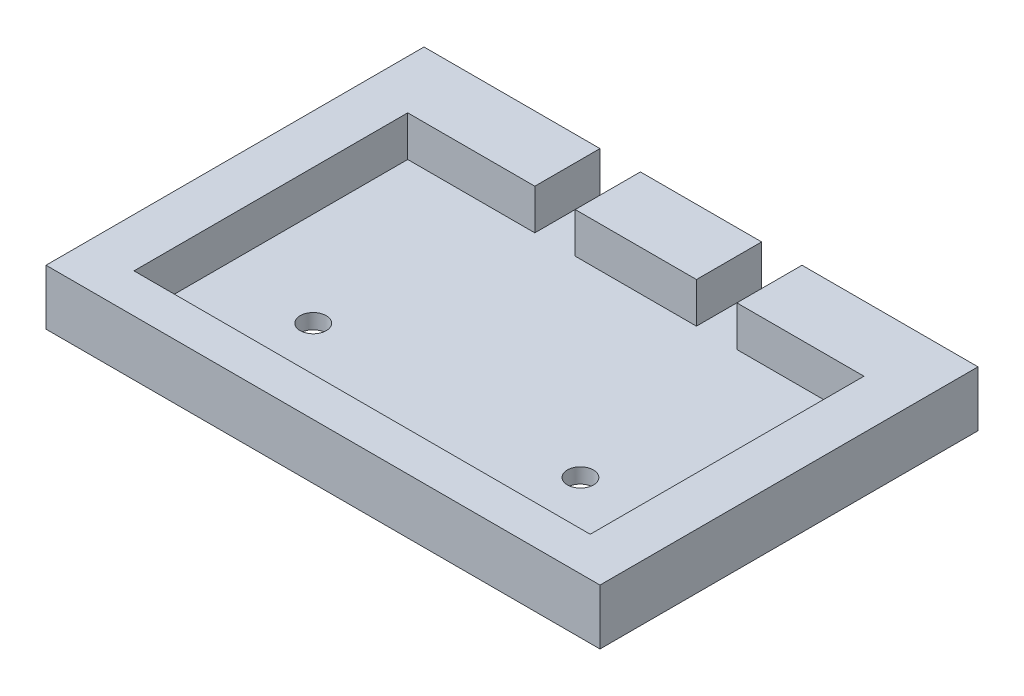
ISO-10303-21;
HEADER;
FILE_DESCRIPTION(('STEP AP214'),'2;1');
FILE_NAME('part.step','',(''),(''),'','','');
FILE_SCHEMA(('AUTOMOTIVE_DESIGN { 1 0 10303 214 1 1 1 1 }'));
ENDSEC;
DATA;
#1=APPLICATION_CONTEXT('core data for automotive mechanical design processes');
#2=APPLICATION_PROTOCOL_DEFINITION('international standard','automotive_design',2000,#1);
#3=PRODUCT_CONTEXT('',#1,'mechanical');
#4=PRODUCT('Part','Part','',(#3));
#5=PRODUCT_RELATED_PRODUCT_CATEGORY('part','',(#4));
#6=PRODUCT_DEFINITION_FORMATION('','',#4);
#7=PRODUCT_DEFINITION_CONTEXT('part definition',#1,'design');
#8=PRODUCT_DEFINITION('design','',#6,#7);
#9=PRODUCT_DEFINITION_SHAPE('','',#8);
#10=(LENGTH_UNIT() NAMED_UNIT(*) SI_UNIT(.MILLI.,.METRE.));
#11=(NAMED_UNIT(*) PLANE_ANGLE_UNIT() SI_UNIT($,.RADIAN.));
#12=(NAMED_UNIT(*) SI_UNIT($,.STERADIAN.) SOLID_ANGLE_UNIT());
#13=UNCERTAINTY_MEASURE_WITH_UNIT(LENGTH_MEASURE(1.E-05),#10,'distance_accuracy_value','');
#14=(GEOMETRIC_REPRESENTATION_CONTEXT(3) GLOBAL_UNCERTAINTY_ASSIGNED_CONTEXT((#13)) GLOBAL_UNIT_ASSIGNED_CONTEXT((#10,
#11,#12)) REPRESENTATION_CONTEXT('',''));
#15=CARTESIAN_POINT('',(0.,0.,0.));
#16=DIRECTION('',(0.,0.,1.));
#17=DIRECTION('',(1.,0.,0.));
#18=AXIS2_PLACEMENT_3D('',#15,#16,#17);
#19=CARTESIAN_POINT('',(45.5,12.,-35.));
#20=DIRECTION('',(0.,0.,1.));
#21=DIRECTION('',(1.,0.,0.));
#22=AXIS2_PLACEMENT_3D('',#19,#20,#21);
#23=PLANE('',#22);
#24=DIRECTION('',(0.,1.,0.));
#25=VECTOR('',#24,1.);
#26=CARTESIAN_POINT('',(42.5,12.,-35.));
#27=LINE('',#26,#25);
#28=CARTESIAN_POINT('',(42.5,3.5,-35.));
#29=VERTEX_POINT('',#28);
#30=CARTESIAN_POINT('',(42.5,12.,-35.));
#31=VERTEX_POINT('',#30);
#32=EDGE_CURVE('E174',#29,#31,#27,.T.);
#33=ORIENTED_EDGE('',*,*,#32,.F.);
#34=DIRECTION('',(1.,0.,0.));
#35=VECTOR('',#34,1.);
#36=CARTESIAN_POINT('',(42.5,3.5,-35.));
#37=LINE('',#36,#35);
#38=CARTESIAN_POINT('',(-42.5,3.5,-35.));
#39=VERTEX_POINT('',#38);
#40=EDGE_CURVE('E276',#39,#29,#37,.T.);
#41=ORIENTED_EDGE('',*,*,#40,.F.);
#42=DIRECTION('',(0.,-1.,0.));
#43=VECTOR('',#42,1.);
#44=CARTESIAN_POINT('',(-42.5,12.,-35.));
#45=LINE('',#44,#43);
#46=CARTESIAN_POINT('',(-42.5,12.,-35.));
#47=VERTEX_POINT('',#46);
#48=EDGE_CURVE('E176',#47,#39,#45,.T.);
#49=ORIENTED_EDGE('',*,*,#48,.F.);
#50=DIRECTION('',(-1.,0.,0.));
#51=VECTOR('',#50,1.);
#52=CARTESIAN_POINT('',(45.5,12.,-35.));
#53=LINE('',#52,#51);
#54=CARTESIAN_POINT('',(-15.5,12.,-35.));
#55=VERTEX_POINT('',#54);
#56=EDGE_CURVE('E246',#55,#47,#53,.T.);
#57=ORIENTED_EDGE('',*,*,#56,.F.);
#58=DIRECTION('',(0.,1.,0.));
#59=VECTOR('',#58,1.);
#60=CARTESIAN_POINT('',(-15.5,12.,-35.));
#61=LINE('',#60,#59);
#62=CARTESIAN_POINT('',(-15.5,5.8,-35.));
#63=VERTEX_POINT('',#62);
#64=EDGE_CURVE('E256',#63,#55,#61,.T.);
#65=ORIENTED_EDGE('',*,*,#64,.F.);
#66=DIRECTION('',(-1.,0.,0.));
#67=VECTOR('',#66,1.);
#68=CARTESIAN_POINT('',(-9.29999999999998,5.8,-35.));
#69=LINE('',#68,#67);
#70=CARTESIAN_POINT('',(-9.29999999999998,5.8,-35.));
#71=VERTEX_POINT('',#70);
#72=EDGE_CURVE('E253',#71,#63,#69,.T.);
#73=ORIENTED_EDGE('',*,*,#72,.F.);
#74=DIRECTION('',(0.,-1.,0.));
#75=VECTOR('',#74,1.);
#76=CARTESIAN_POINT('',(-9.29999999999998,12.,-35.));
#77=LINE('',#76,#75);
#78=CARTESIAN_POINT('',(-9.29999999999998,12.,-35.));
#79=VERTEX_POINT('',#78);
#80=EDGE_CURVE('E236',#79,#71,#77,.T.);
#81=ORIENTED_EDGE('',*,*,#80,.F.);
#82=CARTESIAN_POINT('',(9.30000000000002,12.,-35.));
#83=VERTEX_POINT('',#82);
#84=EDGE_CURVE('E265',#83,#79,#53,.T.);
#85=ORIENTED_EDGE('',*,*,#84,.F.);
#86=DIRECTION('',(0.,1.,0.));
#87=VECTOR('',#86,1.);
#88=CARTESIAN_POINT('',(9.30000000000002,12.,-35.));
#89=LINE('',#88,#87);
#90=CARTESIAN_POINT('',(9.30000000000002,5.8,-35.));
#91=VERTEX_POINT('',#90);
#92=EDGE_CURVE('E241',#91,#83,#89,.T.);
#93=ORIENTED_EDGE('',*,*,#92,.F.);
#94=DIRECTION('',(-1.,0.,0.));
#95=VECTOR('',#94,1.);
#96=CARTESIAN_POINT('',(15.5,5.8,-35.));
#97=LINE('',#96,#95);
#98=CARTESIAN_POINT('',(15.5,5.8,-35.));
#99=VERTEX_POINT('',#98);
#100=EDGE_CURVE('E239',#99,#91,#97,.T.);
#101=ORIENTED_EDGE('',*,*,#100,.F.);
#102=DIRECTION('',(0.,-1.,0.));
#103=VECTOR('',#102,1.);
#104=CARTESIAN_POINT('',(15.5,12.,-35.));
#105=LINE('',#104,#103);
#106=CARTESIAN_POINT('',(15.5,12.,-35.));
#107=VERTEX_POINT('',#106);
#108=EDGE_CURVE('E237',#107,#99,#105,.T.);
#109=ORIENTED_EDGE('',*,*,#108,.F.);
#110=EDGE_CURVE('E43',#31,#107,#53,.T.);
#111=ORIENTED_EDGE('',*,*,#110,.F.);
#112=EDGE_LOOP('',(#33,#41,#49,#57,#65,#73,#81,#85,#93,#101,#109,#111));
#113=FACE_BOUND('',#112,.T.);
#114=ADVANCED_FACE('F36',(#113),#23,.F.);
#115=CARTESIAN_POINT('',(0.,12.,0.));
#116=DIRECTION('',(0.,1.,0.));
#117=DIRECTION('',(0.,0.,1.));
#118=AXIS2_PLACEMENT_3D('',#115,#116,#117);
#119=PLANE('',#118);
#120=DIRECTION('',(-1.,0.,0.));
#121=VECTOR('',#120,1.);
#122=CARTESIAN_POINT('',(-42.5,12.,23.));
#123=LINE('',#122,#121);
#124=CARTESIAN_POINT('',(42.5,12.,23.));
#125=VERTEX_POINT('',#124);
#126=CARTESIAN_POINT('',(-42.5,12.,23.));
#127=VERTEX_POINT('',#126);
#128=EDGE_CURVE('E160',#125,#127,#123,.T.);
#129=ORIENTED_EDGE('',*,*,#128,.F.);
#130=DIRECTION('',(0.,0.,-1.));
#131=VECTOR('',#130,1.);
#132=CARTESIAN_POINT('',(42.5,12.,-42.1667108690839));
#133=LINE('',#132,#131);
#134=EDGE_CURVE('E167',#125,#31,#133,.T.);
#135=ORIENTED_EDGE('',*,*,#134,.T.);
#136=ORIENTED_EDGE('',*,*,#110,.T.);
#137=DIRECTION('',(0.,0.,-1.));
#138=VECTOR('',#137,1.);
#139=CARTESIAN_POINT('',(15.5,12.,-20.));
#140=LINE('',#139,#138);
#141=CARTESIAN_POINT('',(15.5,12.,-25.));
#142=VERTEX_POINT('',#141);
#143=EDGE_CURVE('E244',#142,#107,#140,.T.);
#144=ORIENTED_EDGE('',*,*,#143,.F.);
#145=DIRECTION('',(-1.,0.,0.));
#146=VECTOR('',#145,1.);
#147=CARTESIAN_POINT('',(-35.,12.,-25.));
#148=LINE('',#147,#146);
#149=CARTESIAN_POINT('',(35.,12.,-25.));
#150=VERTEX_POINT('',#149);
#151=EDGE_CURVE('E185',#150,#142,#148,.T.);
#152=ORIENTED_EDGE('',*,*,#151,.F.);
#153=DIRECTION('',(0.,0.,-1.));
#154=VECTOR('',#153,1.);
#155=CARTESIAN_POINT('',(35.,12.,-25.));
#156=LINE('',#155,#154);
#157=CARTESIAN_POINT('',(35.,12.,17.));
#158=VERTEX_POINT('',#157);
#159=EDGE_CURVE('E190',#158,#150,#156,.T.);
#160=ORIENTED_EDGE('',*,*,#159,.F.);
#161=DIRECTION('',(1.,0.,0.));
#162=VECTOR('',#161,1.);
#163=CARTESIAN_POINT('',(-35.,12.,17.));
#164=LINE('',#163,#162);
#165=CARTESIAN_POINT('',(-35.,12.,17.));
#166=VERTEX_POINT('',#165);
#167=EDGE_CURVE('E193',#166,#158,#164,.T.);
#168=ORIENTED_EDGE('',*,*,#167,.F.);
#169=DIRECTION('',(0.,0.,1.));
#170=VECTOR('',#169,1.);
#171=CARTESIAN_POINT('',(-35.,12.,-25.));
#172=LINE('',#171,#170);
#173=CARTESIAN_POINT('',(-35.,12.,-25.));
#174=VERTEX_POINT('',#173);
#175=EDGE_CURVE('E184',#174,#166,#172,.T.);
#176=ORIENTED_EDGE('',*,*,#175,.F.);
#177=CARTESIAN_POINT('',(-15.5,12.,-25.));
#178=VERTEX_POINT('',#177);
#179=EDGE_CURVE('E189',#178,#174,#148,.T.);
#180=ORIENTED_EDGE('',*,*,#179,.F.);
#181=DIRECTION('',(0.,0.,-1.));
#182=VECTOR('',#181,1.);
#183=CARTESIAN_POINT('',(-15.5,12.,-20.));
#184=LINE('',#183,#182);
#185=EDGE_CURVE('E261',#178,#55,#184,.T.);
#186=ORIENTED_EDGE('',*,*,#185,.T.);
#187=ORIENTED_EDGE('',*,*,#56,.T.);
#188=DIRECTION('',(0.,0.,1.));
#189=VECTOR('',#188,1.);
#190=CARTESIAN_POINT('',(-42.5,12.,-42.1667108690839));
#191=LINE('',#190,#189);
#192=EDGE_CURVE('E170',#47,#127,#191,.T.);
#193=ORIENTED_EDGE('',*,*,#192,.T.);
#194=EDGE_LOOP('',(#129,#135,#136,#144,#152,#160,#168,#176,#180,#186,#187,#193));
#195=FACE_BOUND('',#194,.T.);
#196=ADVANCED_FACE('F166',(#195),#119,.T.);
#197=CARTESIAN_POINT('',(9.30000000000002,12.,-25.));
#198=VERTEX_POINT('',#197);
#199=CARTESIAN_POINT('',(-9.29999999999998,12.,-25.));
#200=VERTEX_POINT('',#199);
#201=EDGE_CURVE('E188',#198,#200,#148,.T.);
#202=ORIENTED_EDGE('',*,*,#201,.F.);
#203=DIRECTION('',(0.,0.,-1.));
#204=VECTOR('',#203,1.);
#205=CARTESIAN_POINT('',(9.30000000000002,12.,-20.));
#206=LINE('',#205,#204);
#207=EDGE_CURVE('E247',#198,#83,#206,.T.);
#208=ORIENTED_EDGE('',*,*,#207,.T.);
#209=ORIENTED_EDGE('',*,*,#84,.T.);
#210=DIRECTION('',(0.,0.,-1.));
#211=VECTOR('',#210,1.);
#212=CARTESIAN_POINT('',(-9.29999999999998,12.,-20.));
#213=LINE('',#212,#211);
#214=EDGE_CURVE('E80',#200,#79,#213,.T.);
#215=ORIENTED_EDGE('',*,*,#214,.F.);
#216=EDGE_LOOP('',(#202,#208,#209,#215));
#217=FACE_BOUND('',#216,.T.);
#218=ADVANCED_FACE('F311',(#217),#119,.T.);
#219=CARTESIAN_POINT('',(20.5,0.,4.00000000000002));
#220=DIRECTION('',(0.,1.,0.));
#221=DIRECTION('',(0.,0.,1.));
#222=AXIS2_PLACEMENT_3D('',#219,#220,#221);
#223=CYLINDRICAL_SURFACE('',#222,2.);
#224=CARTESIAN_POINT('',(20.5,3.5,4.00000000000002));
#225=DIRECTION('',(0.,1.,0.));
#226=DIRECTION('',(0.,0.,1.));
#227=AXIS2_PLACEMENT_3D('',#224,#225,#226);
#228=CIRCLE('',#227,2.);
#229=CARTESIAN_POINT('',(20.5,3.5,6.00000000000002));
#230=VERTEX_POINT('',#229);
#231=EDGE_CURVE('E178',#230,#230,#228,.F.);
#232=ORIENTED_EDGE('',*,*,#231,.T.);
#233=EDGE_LOOP('',(#232));
#234=FACE_BOUND('',#233,.T.);
#235=CARTESIAN_POINT('',(20.5,5.8,4.00000000000002));
#236=DIRECTION('',(0.,-1.,0.));
#237=DIRECTION('',(0.,0.,-1.));
#238=AXIS2_PLACEMENT_3D('',#235,#236,#237);
#239=CIRCLE('',#238,2.);
#240=CARTESIAN_POINT('',(20.5,5.8,2.00000000000001));
#241=VERTEX_POINT('',#240);
#242=EDGE_CURVE('E222',#241,#241,#239,.F.);
#243=ORIENTED_EDGE('',*,*,#242,.T.);
#244=EDGE_LOOP('',(#243));
#245=FACE_BOUND('',#244,.T.);
#246=ADVANCED_FACE('F292',(#234,#245),#223,.F.);
#247=CARTESIAN_POINT('',(-20.5,0.,4.00000000000002));
#248=DIRECTION('',(0.,1.,0.));
#249=DIRECTION('',(0.,0.,1.));
#250=AXIS2_PLACEMENT_3D('',#247,#248,#249);
#251=CYLINDRICAL_SURFACE('',#250,2.);
#252=CARTESIAN_POINT('',(-20.5,3.5,4.00000000000002));
#253=DIRECTION('',(0.,1.,0.));
#254=DIRECTION('',(0.,0.,1.));
#255=AXIS2_PLACEMENT_3D('',#252,#253,#254);
#256=CIRCLE('',#255,2.);
#257=CARTESIAN_POINT('',(-20.5,3.5,6.00000000000002));
#258=VERTEX_POINT('',#257);
#259=EDGE_CURVE('E286',#258,#258,#256,.F.);
#260=ORIENTED_EDGE('',*,*,#259,.T.);
#261=EDGE_LOOP('',(#260));
#262=FACE_BOUND('',#261,.T.);
#263=CARTESIAN_POINT('',(-20.5,5.8,4.00000000000002));
#264=DIRECTION('',(0.,-1.,0.));
#265=DIRECTION('',(0.,0.,-1.));
#266=AXIS2_PLACEMENT_3D('',#263,#264,#265);
#267=CIRCLE('',#266,2.);
#268=CARTESIAN_POINT('',(-20.5,5.8,2.00000000000001));
#269=VERTEX_POINT('',#268);
#270=EDGE_CURVE('E219',#269,#269,#267,.F.);
#271=ORIENTED_EDGE('',*,*,#270,.T.);
#272=EDGE_LOOP('',(#271));
#273=FACE_BOUND('',#272,.T.);
#274=ADVANCED_FACE('F319',(#262,#273),#251,.F.);
#275=CARTESIAN_POINT('',(-9.29999999999998,12.,-20.));
#276=DIRECTION('',(1.,0.,0.));
#277=DIRECTION('',(0.,0.,-1.));
#278=AXIS2_PLACEMENT_3D('',#275,#276,#277);
#279=PLANE('',#278);
#280=DIRECTION('',(0.,0.,-1.));
#281=VECTOR('',#280,1.);
#282=CARTESIAN_POINT('',(-9.29999999999998,5.8,-20.));
#283=LINE('',#282,#281);
#284=CARTESIAN_POINT('',(-9.29999999999998,5.8,-25.));
#285=VERTEX_POINT('',#284);
#286=EDGE_CURVE('E259',#285,#71,#283,.T.);
#287=ORIENTED_EDGE('',*,*,#286,.F.);
#288=DIRECTION('',(0.,1.,0.));
#289=VECTOR('',#288,1.);
#290=CARTESIAN_POINT('',(-9.29999999999998,12.,-25.));
#291=LINE('',#290,#289);
#292=EDGE_CURVE('E234',#285,#200,#291,.T.);
#293=ORIENTED_EDGE('',*,*,#292,.T.);
#294=ORIENTED_EDGE('',*,*,#214,.T.);
#295=ORIENTED_EDGE('',*,*,#80,.T.);
#296=EDGE_LOOP('',(#287,#293,#294,#295));
#297=FACE_BOUND('',#296,.T.);
#298=ADVANCED_FACE('F322',(#297),#279,.F.);
#299=CARTESIAN_POINT('',(-15.5,12.,-20.));
#300=DIRECTION('',(-1.,0.,0.));
#301=DIRECTION('',(0.,0.,1.));
#302=AXIS2_PLACEMENT_3D('',#299,#300,#301);
#303=PLANE('',#302);
#304=ORIENTED_EDGE('',*,*,#185,.F.);
#305=DIRECTION('',(0.,-1.,0.));
#306=VECTOR('',#305,1.);
#307=CARTESIAN_POINT('',(-15.5,12.,-25.));
#308=LINE('',#307,#306);
#309=CARTESIAN_POINT('',(-15.5,5.8,-25.));
#310=VERTEX_POINT('',#309);
#311=EDGE_CURVE('E231',#178,#310,#308,.T.);
#312=ORIENTED_EDGE('',*,*,#311,.T.);
#313=DIRECTION('',(0.,0.,-1.));
#314=VECTOR('',#313,1.);
#315=CARTESIAN_POINT('',(-15.5,5.8,-20.));
#316=LINE('',#315,#314);
#317=EDGE_CURVE('E263',#310,#63,#316,.T.);
#318=ORIENTED_EDGE('',*,*,#317,.T.);
#319=ORIENTED_EDGE('',*,*,#64,.T.);
#320=EDGE_LOOP('',(#304,#312,#318,#319));
#321=FACE_BOUND('',#320,.T.);
#322=ADVANCED_FACE('F326',(#321),#303,.F.);
#323=CARTESIAN_POINT('',(15.5,12.,-20.));
#324=DIRECTION('',(1.,0.,0.));
#325=DIRECTION('',(0.,0.,-1.));
#326=AXIS2_PLACEMENT_3D('',#323,#324,#325);
#327=PLANE('',#326);
#328=DIRECTION('',(0.,0.,-1.));
#329=VECTOR('',#328,1.);
#330=CARTESIAN_POINT('',(15.5,5.8,-20.));
#331=LINE('',#330,#329);
#332=CARTESIAN_POINT('',(15.5,5.8,-25.));
#333=VERTEX_POINT('',#332);
#334=EDGE_CURVE('E88',#333,#99,#331,.T.);
#335=ORIENTED_EDGE('',*,*,#334,.F.);
#336=DIRECTION('',(0.,1.,0.));
#337=VECTOR('',#336,1.);
#338=CARTESIAN_POINT('',(15.5,12.,-25.));
#339=LINE('',#338,#337);
#340=EDGE_CURVE('E228',#333,#142,#339,.T.);
#341=ORIENTED_EDGE('',*,*,#340,.T.);
#342=ORIENTED_EDGE('',*,*,#143,.T.);
#343=ORIENTED_EDGE('',*,*,#108,.T.);
#344=EDGE_LOOP('',(#335,#341,#342,#343));
#345=FACE_BOUND('',#344,.T.);
#346=ADVANCED_FACE('F329',(#345),#327,.F.);
#347=CARTESIAN_POINT('',(9.30000000000002,12.,-20.));
#348=DIRECTION('',(-1.,0.,0.));
#349=DIRECTION('',(0.,0.,1.));
#350=AXIS2_PLACEMENT_3D('',#347,#348,#349);
#351=PLANE('',#350);
#352=ORIENTED_EDGE('',*,*,#207,.F.);
#353=DIRECTION('',(0.,-1.,0.));
#354=VECTOR('',#353,1.);
#355=CARTESIAN_POINT('',(9.30000000000002,12.,-25.));
#356=LINE('',#355,#354);
#357=CARTESIAN_POINT('',(9.30000000000002,5.8,-25.));
#358=VERTEX_POINT('',#357);
#359=EDGE_CURVE('E225',#198,#358,#356,.T.);
#360=ORIENTED_EDGE('',*,*,#359,.T.);
#361=DIRECTION('',(0.,0.,-1.));
#362=VECTOR('',#361,1.);
#363=CARTESIAN_POINT('',(9.30000000000002,5.8,-20.));
#364=LINE('',#363,#362);
#365=EDGE_CURVE('E249',#358,#91,#364,.T.);
#366=ORIENTED_EDGE('',*,*,#365,.T.);
#367=ORIENTED_EDGE('',*,*,#92,.T.);
#368=EDGE_LOOP('',(#352,#360,#366,#367));
#369=FACE_BOUND('',#368,.T.);
#370=ADVANCED_FACE('F333',(#369),#351,.F.);
#371=CARTESIAN_POINT('',(15.5,5.8,-20.));
#372=DIRECTION('',(0.,-1.,0.));
#373=DIRECTION('',(0.,0.,-1.));
#374=AXIS2_PLACEMENT_3D('',#371,#372,#373);
#375=PLANE('',#374);
#376=DIRECTION('',(-1.,0.,0.));
#377=VECTOR('',#376,1.);
#378=CARTESIAN_POINT('',(-35.,5.8,-25.));
#379=LINE('',#378,#377);
#380=EDGE_CURVE('E208',#358,#285,#379,.T.);
#381=ORIENTED_EDGE('',*,*,#380,.T.);
#382=ORIENTED_EDGE('',*,*,#286,.T.);
#383=ORIENTED_EDGE('',*,*,#72,.T.);
#384=ORIENTED_EDGE('',*,*,#317,.F.);
#385=CARTESIAN_POINT('',(-35.,5.8,-25.));
#386=VERTEX_POINT('',#385);
#387=EDGE_CURVE('E209',#310,#386,#379,.T.);
#388=ORIENTED_EDGE('',*,*,#387,.T.);
#389=DIRECTION('',(0.,0.,1.));
#390=VECTOR('',#389,1.);
#391=CARTESIAN_POINT('',(-35.,5.8,-25.));
#392=LINE('',#391,#390);
#393=CARTESIAN_POINT('',(-35.,5.8,17.));
#394=VERTEX_POINT('',#393);
#395=EDGE_CURVE('E201',#386,#394,#392,.T.);
#396=ORIENTED_EDGE('',*,*,#395,.T.);
#397=DIRECTION('',(1.,0.,0.));
#398=VECTOR('',#397,1.);
#399=CARTESIAN_POINT('',(-35.,5.8,17.));
#400=LINE('',#399,#398);
#401=CARTESIAN_POINT('',(35.,5.8,17.));
#402=VERTEX_POINT('',#401);
#403=EDGE_CURVE('E187',#394,#402,#400,.T.);
#404=ORIENTED_EDGE('',*,*,#403,.T.);
#405=DIRECTION('',(0.,0.,-1.));
#406=VECTOR('',#405,1.);
#407=CARTESIAN_POINT('',(35.,5.8,-25.));
#408=LINE('',#407,#406);
#409=CARTESIAN_POINT('',(35.,5.8,-25.));
#410=VERTEX_POINT('',#409);
#411=EDGE_CURVE('E210',#402,#410,#408,.T.);
#412=ORIENTED_EDGE('',*,*,#411,.T.);
#413=EDGE_CURVE('E206',#410,#333,#379,.T.);
#414=ORIENTED_EDGE('',*,*,#413,.T.);
#415=ORIENTED_EDGE('',*,*,#334,.T.);
#416=ORIENTED_EDGE('',*,*,#100,.T.);
#417=ORIENTED_EDGE('',*,*,#365,.F.);
#418=EDGE_LOOP('',(#381,#382,#383,#384,#388,#396,#404,#412,#414,#415,#416,#417));
#419=FACE_BOUND('',#418,.T.);
#420=ORIENTED_EDGE('',*,*,#270,.F.);
#421=EDGE_LOOP('',(#420));
#422=FACE_BOUND('',#421,.T.);
#423=ORIENTED_EDGE('',*,*,#242,.F.);
#424=EDGE_LOOP('',(#423));
#425=FACE_BOUND('',#424,.T.);
#426=ADVANCED_FACE('F335',(#419,#422,#425),#375,.F.);
#427=CARTESIAN_POINT('',(-35.,-75.8333265278342,-25.));
#428=DIRECTION('',(0.,0.,-1.));
#429=DIRECTION('',(-1.,0.,0.));
#430=AXIS2_PLACEMENT_3D('',#427,#428,#429);
#431=PLANE('',#430);
#432=ORIENTED_EDGE('',*,*,#380,.F.);
#433=ORIENTED_EDGE('',*,*,#359,.F.);
#434=ORIENTED_EDGE('',*,*,#201,.T.);
#435=ORIENTED_EDGE('',*,*,#292,.F.);
#436=EDGE_LOOP('',(#432,#433,#434,#435));
#437=FACE_BOUND('',#436,.T.);
#438=ADVANCED_FACE('F338',(#437),#431,.F.);
#439=ORIENTED_EDGE('',*,*,#179,.T.);
#440=DIRECTION('',(0.,1.,0.));
#441=VECTOR('',#440,1.);
#442=CARTESIAN_POINT('',(-35.,-75.8333265278342,-25.));
#443=LINE('',#442,#441);
#444=EDGE_CURVE('E205',#386,#174,#443,.T.);
#445=ORIENTED_EDGE('',*,*,#444,.F.);
#446=ORIENTED_EDGE('',*,*,#387,.F.);
#447=ORIENTED_EDGE('',*,*,#311,.F.);
#448=EDGE_LOOP('',(#439,#445,#446,#447));
#449=FACE_BOUND('',#448,.T.);
#450=ADVANCED_FACE('F354',(#449),#431,.F.);
#451=ORIENTED_EDGE('',*,*,#413,.F.);
#452=DIRECTION('',(0.,1.,0.));
#453=VECTOR('',#452,1.);
#454=CARTESIAN_POINT('',(35.,-75.8333265278342,-25.));
#455=LINE('',#454,#453);
#456=EDGE_CURVE('E213',#410,#150,#455,.T.);
#457=ORIENTED_EDGE('',*,*,#456,.T.);
#458=ORIENTED_EDGE('',*,*,#151,.T.);
#459=ORIENTED_EDGE('',*,*,#340,.F.);
#460=EDGE_LOOP('',(#451,#457,#458,#459));
#461=FACE_BOUND('',#460,.T.);
#462=ADVANCED_FACE('F346',(#461),#431,.F.);
#463=CARTESIAN_POINT('',(-35.,-75.8333265278342,17.));
#464=DIRECTION('',(0.,0.,1.));
#465=DIRECTION('',(1.,0.,0.));
#466=AXIS2_PLACEMENT_3D('',#463,#464,#465);
#467=PLANE('',#466);
#468=DIRECTION('',(0.,1.,0.));
#469=VECTOR('',#468,1.);
#470=CARTESIAN_POINT('',(-35.,-75.8333265278342,17.));
#471=LINE('',#470,#469);
#472=EDGE_CURVE('E204',#394,#166,#471,.T.);
#473=ORIENTED_EDGE('',*,*,#472,.T.);
#474=ORIENTED_EDGE('',*,*,#167,.T.);
#475=DIRECTION('',(0.,1.,0.));
#476=VECTOR('',#475,1.);
#477=CARTESIAN_POINT('',(35.,-75.8333265278342,17.));
#478=LINE('',#477,#476);
#479=EDGE_CURVE('E200',#402,#158,#478,.T.);
#480=ORIENTED_EDGE('',*,*,#479,.F.);
#481=ORIENTED_EDGE('',*,*,#403,.F.);
#482=EDGE_LOOP('',(#473,#474,#480,#481));
#483=FACE_BOUND('',#482,.T.);
#484=ADVANCED_FACE('F342',(#483),#467,.F.);
#485=CARTESIAN_POINT('',(35.,-75.8333265278342,-25.));
#486=DIRECTION('',(1.,0.,0.));
#487=DIRECTION('',(0.,0.,-1.));
#488=AXIS2_PLACEMENT_3D('',#485,#486,#487);
#489=PLANE('',#488);
#490=ORIENTED_EDGE('',*,*,#479,.T.);
#491=ORIENTED_EDGE('',*,*,#159,.T.);
#492=ORIENTED_EDGE('',*,*,#456,.F.);
#493=ORIENTED_EDGE('',*,*,#411,.F.);
#494=EDGE_LOOP('',(#490,#491,#492,#493));
#495=FACE_BOUND('',#494,.T.);
#496=ADVANCED_FACE('F345',(#495),#489,.F.);
#497=CARTESIAN_POINT('',(-35.,-75.8333265278342,-25.));
#498=DIRECTION('',(-1.,0.,0.));
#499=DIRECTION('',(0.,0.,1.));
#500=AXIS2_PLACEMENT_3D('',#497,#498,#499);
#501=PLANE('',#500);
#502=ORIENTED_EDGE('',*,*,#444,.T.);
#503=ORIENTED_EDGE('',*,*,#175,.T.);
#504=ORIENTED_EDGE('',*,*,#472,.F.);
#505=ORIENTED_EDGE('',*,*,#395,.F.);
#506=EDGE_LOOP('',(#502,#503,#504,#505));
#507=FACE_BOUND('',#506,.T.);
#508=ADVANCED_FACE('F350',(#507),#501,.F.);
#509=CARTESIAN_POINT('',(-42.5,-16.,-42.1667108690839));
#510=DIRECTION('',(-1.,0.,0.));
#511=DIRECTION('',(0.,0.,1.));
#512=AXIS2_PLACEMENT_3D('',#509,#510,#511);
#513=PLANE('',#512);
#514=DIRECTION('',(0.,1.,0.));
#515=VECTOR('',#514,1.);
#516=CARTESIAN_POINT('',(-42.5,-5.,23.));
#517=LINE('',#516,#515);
#518=CARTESIAN_POINT('',(-42.5,3.5,23.));
#519=VERTEX_POINT('',#518);
#520=EDGE_CURVE('E50',#519,#127,#517,.T.);
#521=ORIENTED_EDGE('',*,*,#520,.T.);
#522=ORIENTED_EDGE('',*,*,#192,.F.);
#523=ORIENTED_EDGE('',*,*,#48,.T.);
#524=DIRECTION('',(0.,0.,-1.));
#525=VECTOR('',#524,1.);
#526=CARTESIAN_POINT('',(-42.5,3.5,33.));
#527=LINE('',#526,#525);
#528=EDGE_CURVE('E280',#519,#39,#527,.T.);
#529=ORIENTED_EDGE('',*,*,#528,.F.);
#530=EDGE_LOOP('',(#521,#522,#523,#529));
#531=FACE_BOUND('',#530,.T.);
#532=ADVANCED_FACE('F279',(#531),#513,.T.);
#533=CARTESIAN_POINT('',(42.5,-16.,-42.1667108690839));
#534=DIRECTION('',(1.,0.,0.));
#535=DIRECTION('',(0.,0.,-1.));
#536=AXIS2_PLACEMENT_3D('',#533,#534,#535);
#537=PLANE('',#536);
#538=DIRECTION('',(0.,1.,0.));
#539=VECTOR('',#538,1.);
#540=CARTESIAN_POINT('',(42.5,-5.,23.));
#541=LINE('',#540,#539);
#542=CARTESIAN_POINT('',(42.5,3.5,23.));
#543=VERTEX_POINT('',#542);
#544=EDGE_CURVE('E157',#543,#125,#541,.T.);
#545=ORIENTED_EDGE('',*,*,#544,.F.);
#546=DIRECTION('',(0.,0.,-1.));
#547=VECTOR('',#546,1.);
#548=CARTESIAN_POINT('',(42.5,3.5,33.));
#549=LINE('',#548,#547);
#550=EDGE_CURVE('E284',#543,#29,#549,.T.);
#551=ORIENTED_EDGE('',*,*,#550,.T.);
#552=ORIENTED_EDGE('',*,*,#32,.T.);
#553=ORIENTED_EDGE('',*,*,#134,.F.);
#554=EDGE_LOOP('',(#545,#551,#552,#553));
#555=FACE_BOUND('',#554,.T.);
#556=ADVANCED_FACE('F172',(#555),#537,.T.);
#557=CARTESIAN_POINT('',(42.5,3.5,33.));
#558=DIRECTION('',(0.,1.,0.));
#559=DIRECTION('',(0.,0.,1.));
#560=AXIS2_PLACEMENT_3D('',#557,#558,#559);
#561=PLANE('',#560);
#562=ORIENTED_EDGE('',*,*,#259,.F.);
#563=EDGE_LOOP('',(#562));
#564=FACE_BOUND('',#563,.T.);
#565=ORIENTED_EDGE('',*,*,#550,.F.);
#566=DIRECTION('',(-1.,0.,0.));
#567=VECTOR('',#566,1.);
#568=CARTESIAN_POINT('',(42.5,3.5,23.));
#569=LINE('',#568,#567);
#570=EDGE_CURVE('E11',#543,#519,#569,.T.);
#571=ORIENTED_EDGE('',*,*,#570,.T.);
#572=ORIENTED_EDGE('',*,*,#528,.T.);
#573=ORIENTED_EDGE('',*,*,#40,.T.);
#574=EDGE_LOOP('',(#565,#571,#572,#573));
#575=FACE_BOUND('',#574,.T.);
#576=ORIENTED_EDGE('',*,*,#231,.F.);
#577=EDGE_LOOP('',(#576));
#578=FACE_BOUND('',#577,.T.);
#579=ADVANCED_FACE('F295',(#564,#575,#578),#561,.F.);
#580=CARTESIAN_POINT('',(-42.5,-5.,23.));
#581=DIRECTION('',(0.,0.,-1.));
#582=DIRECTION('',(-1.,0.,0.));
#583=AXIS2_PLACEMENT_3D('',#580,#581,#582);
#584=PLANE('',#583);
#585=ORIENTED_EDGE('',*,*,#544,.T.);
#586=ORIENTED_EDGE('',*,*,#128,.T.);
#587=ORIENTED_EDGE('',*,*,#520,.F.);
#588=ORIENTED_EDGE('',*,*,#570,.F.);
#589=EDGE_LOOP('',(#585,#586,#587,#588));
#590=FACE_BOUND('',#589,.T.);
#591=ADVANCED_FACE('F159',(#590),#584,.F.);
#592=CLOSED_SHELL('',(#114,#196,#218,#246,#274,#298,#322,#346,#370,#426,#438,#450,#462,#484,
#496,#508,#532,#556,#579,#591));
#593=MANIFOLD_SOLID_BREP('B2',#592);
#594=ADVANCED_BREP_SHAPE_REPRESENTATION('',(#18,#593),#14);
#595=SHAPE_DEFINITION_REPRESENTATION(#9,#594);
ENDSEC;
END-ISO-10303-21;
